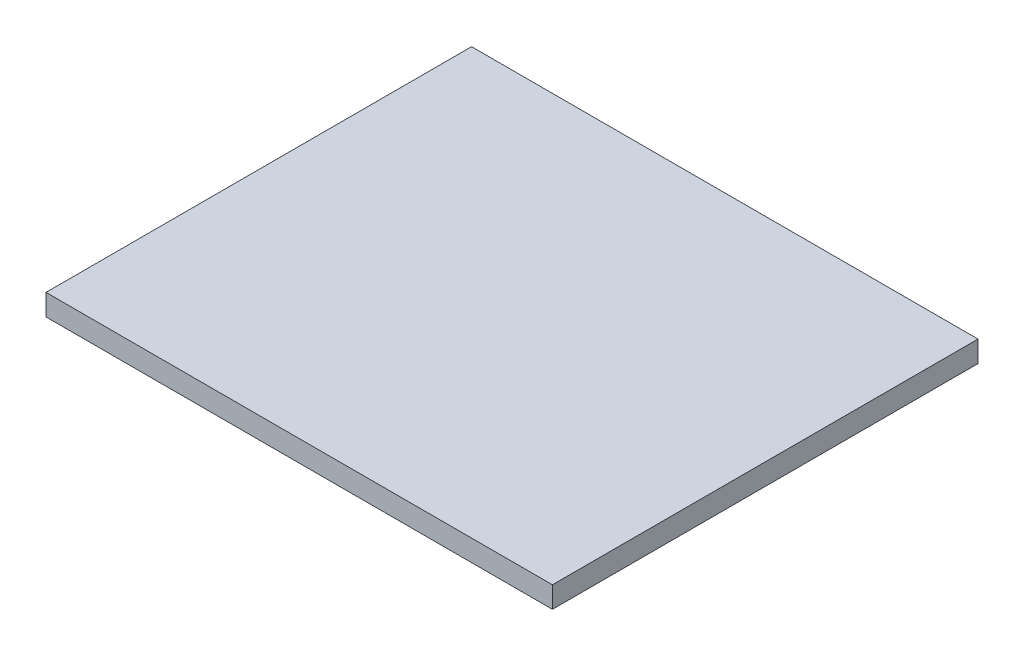
ISO-10303-21;
HEADER;
FILE_DESCRIPTION(('STEP AP214'),'2;1');
FILE_NAME('part.step','',(''),(''),'','','');
FILE_SCHEMA(('AUTOMOTIVE_DESIGN { 1 0 10303 214 1 1 1 1 }'));
ENDSEC;
DATA;
#1=APPLICATION_CONTEXT('core data for automotive mechanical design processes');
#2=APPLICATION_PROTOCOL_DEFINITION('international standard','automotive_design',2000,#1);
#3=PRODUCT_CONTEXT('',#1,'mechanical');
#4=PRODUCT('Part','Part','',(#3));
#5=PRODUCT_RELATED_PRODUCT_CATEGORY('part','',(#4));
#6=PRODUCT_DEFINITION_FORMATION('','',#4);
#7=PRODUCT_DEFINITION_CONTEXT('part definition',#1,'design');
#8=PRODUCT_DEFINITION('design','',#6,#7);
#9=PRODUCT_DEFINITION_SHAPE('','',#8);
#10=(LENGTH_UNIT() NAMED_UNIT(*) SI_UNIT(.MILLI.,.METRE.));
#11=(NAMED_UNIT(*) PLANE_ANGLE_UNIT() SI_UNIT($,.RADIAN.));
#12=(NAMED_UNIT(*) SI_UNIT($,.STERADIAN.) SOLID_ANGLE_UNIT());
#13=UNCERTAINTY_MEASURE_WITH_UNIT(LENGTH_MEASURE(1.E-05),#10,'distance_accuracy_value','');
#14=(GEOMETRIC_REPRESENTATION_CONTEXT(3) GLOBAL_UNCERTAINTY_ASSIGNED_CONTEXT((#13)) GLOBAL_UNIT_ASSIGNED_CONTEXT((#10,
#11,#12)) REPRESENTATION_CONTEXT('',''));
#15=CARTESIAN_POINT('',(0.,0.,0.));
#16=DIRECTION('',(0.,0.,1.));
#17=DIRECTION('',(1.,0.,0.));
#18=AXIS2_PLACEMENT_3D('',#15,#16,#17);
#19=CARTESIAN_POINT('',(0.,0.,0.));
#20=DIRECTION('',(0.,1.,0.));
#21=DIRECTION('',(0.,0.,1.));
#22=AXIS2_PLACEMENT_3D('',#19,#20,#21);
#23=PLANE('',#22);
#24=DIRECTION('',(0.,0.,-1.));
#25=VECTOR('',#24,1.);
#26=CARTESIAN_POINT('',(29.75,0.,-25.));
#27=LINE('',#26,#25);
#28=CARTESIAN_POINT('',(29.75,0.,25.));
#29=VERTEX_POINT('',#28);
#30=CARTESIAN_POINT('',(29.75,0.,-25.));
#31=VERTEX_POINT('',#30);
#32=EDGE_CURVE('E130',#29,#31,#27,.T.);
#33=ORIENTED_EDGE('',*,*,#32,.F.);
#34=DIRECTION('',(1.,0.,0.));
#35=VECTOR('',#34,1.);
#36=CARTESIAN_POINT('',(-29.75,0.,25.));
#37=LINE('',#36,#35);
#38=CARTESIAN_POINT('',(-29.75,0.,25.));
#39=VERTEX_POINT('',#38);
#40=EDGE_CURVE('E163',#39,#29,#37,.T.);
#41=ORIENTED_EDGE('',*,*,#40,.F.);
#42=DIRECTION('',(0.,0.,1.));
#43=VECTOR('',#42,1.);
#44=CARTESIAN_POINT('',(-29.75,0.,-25.));
#45=LINE('',#44,#43);
#46=CARTESIAN_POINT('',(-29.75,0.,-25.));
#47=VERTEX_POINT('',#46);
#48=EDGE_CURVE('E161',#47,#39,#45,.T.);
#49=ORIENTED_EDGE('',*,*,#48,.F.);
#50=DIRECTION('',(-1.,0.,0.));
#51=VECTOR('',#50,1.);
#52=CARTESIAN_POINT('',(-29.75,0.,-25.));
#53=LINE('',#52,#51);
#54=EDGE_CURVE('E156',#31,#47,#53,.T.);
#55=ORIENTED_EDGE('',*,*,#54,.F.);
#56=EDGE_LOOP('',(#33,#41,#49,#55));
#57=FACE_BOUND('',#56,.T.);
#58=DIRECTION('',(0.,0.,-1.));
#59=VECTOR('',#58,1.);
#60=CARTESIAN_POINT('',(-1.75,0.,2.43669858620224));
#61=LINE('',#60,#59);
#62=CARTESIAN_POINT('',(-1.75,0.,7.00000000000002));
#63=VERTEX_POINT('',#62);
#64=CARTESIAN_POINT('',(-1.75,0.,2.43669858620224));
#65=VERTEX_POINT('',#64);
#66=EDGE_CURVE('E56',#63,#65,#61,.T.);
#67=ORIENTED_EDGE('',*,*,#66,.F.);
#68=DIRECTION('',(1.,0.,0.));
#69=VECTOR('',#68,1.);
#70=CARTESIAN_POINT('',(0.,0.,7.00000000000002));
#71=LINE('',#70,#69);
#72=CARTESIAN_POINT('',(1.75,0.,7.00000000000002));
#73=VERTEX_POINT('',#72);
#74=EDGE_CURVE('E131',#63,#73,#71,.T.);
#75=ORIENTED_EDGE('',*,*,#74,.T.);
#76=DIRECTION('',(0.,0.,1.));
#77=VECTOR('',#76,1.);
#78=CARTESIAN_POINT('',(1.75,0.,2.43669858620224));
#79=LINE('',#78,#77);
#80=CARTESIAN_POINT('',(1.75,0.,2.43669858620224));
#81=VERTEX_POINT('',#80);
#82=EDGE_CURVE('E63',#81,#73,#79,.T.);
#83=ORIENTED_EDGE('',*,*,#82,.F.);
#84=CARTESIAN_POINT('',(0.,0.,0.));
#85=DIRECTION('',(0.,1.,0.));
#86=DIRECTION('',(0.,0.,1.));
#87=AXIS2_PLACEMENT_3D('',#84,#85,#86);
#88=CIRCLE('',#87,3.);
#89=EDGE_CURVE('E116',#81,#65,#88,.T.);
#90=ORIENTED_EDGE('',*,*,#89,.T.);
#91=EDGE_LOOP('',(#67,#75,#83,#90));
#92=FACE_BOUND('',#91,.T.);
#93=ADVANCED_FACE('F40',(#57,#92),#23,.F.);
#94=CARTESIAN_POINT('',(29.75,1.5,-25.));
#95=DIRECTION('',(-1.,0.,0.));
#96=DIRECTION('',(0.,0.,1.));
#97=AXIS2_PLACEMENT_3D('',#94,#95,#96);
#98=PLANE('',#97);
#99=ORIENTED_EDGE('',*,*,#32,.T.);
#100=DIRECTION('',(0.,-1.,0.));
#101=VECTOR('',#100,1.);
#102=CARTESIAN_POINT('',(29.75,1.5,-25.));
#103=LINE('',#102,#101);
#104=CARTESIAN_POINT('',(29.75,2.5,-25.));
#105=VERTEX_POINT('',#104);
#106=EDGE_CURVE('E122',#105,#31,#103,.T.);
#107=ORIENTED_EDGE('',*,*,#106,.F.);
#108=DIRECTION('',(0.,0.,-1.));
#109=VECTOR('',#108,1.);
#110=CARTESIAN_POINT('',(29.75,2.5,25.));
#111=LINE('',#110,#109);
#112=CARTESIAN_POINT('',(29.75,2.5,25.));
#113=VERTEX_POINT('',#112);
#114=EDGE_CURVE('E105',#113,#105,#111,.T.);
#115=ORIENTED_EDGE('',*,*,#114,.F.);
#116=DIRECTION('',(0.,-1.,0.));
#117=VECTOR('',#116,1.);
#118=CARTESIAN_POINT('',(29.75,1.5,25.));
#119=LINE('',#118,#117);
#120=EDGE_CURVE('E165',#113,#29,#119,.T.);
#121=ORIENTED_EDGE('',*,*,#120,.T.);
#122=EDGE_LOOP('',(#99,#107,#115,#121));
#123=FACE_BOUND('',#122,.T.);
#124=ADVANCED_FACE('F128',(#123),#98,.F.);
#125=CARTESIAN_POINT('',(-29.75,1.5,-25.));
#126=DIRECTION('',(0.,0.,1.));
#127=DIRECTION('',(1.,0.,0.));
#128=AXIS2_PLACEMENT_3D('',#125,#126,#127);
#129=PLANE('',#128);
#130=DIRECTION('',(0.,-1.,0.));
#131=VECTOR('',#130,1.);
#132=CARTESIAN_POINT('',(-29.75,1.5,-25.));
#133=LINE('',#132,#131);
#134=CARTESIAN_POINT('',(-29.75,2.5,-25.));
#135=VERTEX_POINT('',#134);
#136=EDGE_CURVE('E125',#135,#47,#133,.T.);
#137=ORIENTED_EDGE('',*,*,#136,.F.);
#138=DIRECTION('',(1.,0.,0.));
#139=VECTOR('',#138,1.);
#140=CARTESIAN_POINT('',(-29.75,2.5,-25.));
#141=LINE('',#140,#139);
#142=EDGE_CURVE('E109',#135,#105,#141,.T.);
#143=ORIENTED_EDGE('',*,*,#142,.T.);
#144=ORIENTED_EDGE('',*,*,#106,.T.);
#145=ORIENTED_EDGE('',*,*,#54,.T.);
#146=EDGE_LOOP('',(#137,#143,#144,#145));
#147=FACE_BOUND('',#146,.T.);
#148=ADVANCED_FACE('F121',(#147),#129,.F.);
#149=CARTESIAN_POINT('',(-29.75,1.5,-25.));
#150=DIRECTION('',(1.,0.,0.));
#151=DIRECTION('',(0.,0.,-1.));
#152=AXIS2_PLACEMENT_3D('',#149,#150,#151);
#153=PLANE('',#152);
#154=ORIENTED_EDGE('',*,*,#48,.T.);
#155=DIRECTION('',(0.,-1.,0.));
#156=VECTOR('',#155,1.);
#157=CARTESIAN_POINT('',(-29.75,1.5,25.));
#158=LINE('',#157,#156);
#159=CARTESIAN_POINT('',(-29.75,2.5,25.));
#160=VERTEX_POINT('',#159);
#161=EDGE_CURVE('E134',#160,#39,#158,.T.);
#162=ORIENTED_EDGE('',*,*,#161,.F.);
#163=DIRECTION('',(0.,0.,-1.));
#164=VECTOR('',#163,1.);
#165=CARTESIAN_POINT('',(-29.75,2.5,25.));
#166=LINE('',#165,#164);
#167=EDGE_CURVE('E117',#160,#135,#166,.T.);
#168=ORIENTED_EDGE('',*,*,#167,.T.);
#169=ORIENTED_EDGE('',*,*,#136,.T.);
#170=EDGE_LOOP('',(#154,#162,#168,#169));
#171=FACE_BOUND('',#170,.T.);
#172=ADVANCED_FACE('F174',(#171),#153,.F.);
#173=CARTESIAN_POINT('',(-29.75,1.5,25.));
#174=DIRECTION('',(0.,0.,-1.));
#175=DIRECTION('',(-1.,0.,0.));
#176=AXIS2_PLACEMENT_3D('',#173,#174,#175);
#177=PLANE('',#176);
#178=ORIENTED_EDGE('',*,*,#120,.F.);
#179=DIRECTION('',(1.,0.,0.));
#180=VECTOR('',#179,1.);
#181=CARTESIAN_POINT('',(-29.75,2.5,25.));
#182=LINE('',#181,#180);
#183=EDGE_CURVE('E111',#160,#113,#182,.T.);
#184=ORIENTED_EDGE('',*,*,#183,.F.);
#185=ORIENTED_EDGE('',*,*,#161,.T.);
#186=ORIENTED_EDGE('',*,*,#40,.T.);
#187=EDGE_LOOP('',(#178,#184,#185,#186));
#188=FACE_BOUND('',#187,.T.);
#189=ADVANCED_FACE('F170',(#188),#177,.F.);
#190=CARTESIAN_POINT('',(0.,1.5,0.));
#191=DIRECTION('',(0.,-1.,0.));
#192=DIRECTION('',(0.,0.,-1.));
#193=AXIS2_PLACEMENT_3D('',#190,#191,#192);
#194=CYLINDRICAL_SURFACE('',#193,3.);
#195=DIRECTION('',(0.,-1.,0.));
#196=VECTOR('',#195,1.);
#197=CARTESIAN_POINT('',(-1.75,2.,2.43669858620224));
#198=LINE('',#197,#196);
#199=CARTESIAN_POINT('',(-1.75,2.,2.43669858620224));
#200=VERTEX_POINT('',#199);
#201=EDGE_CURVE('E154',#200,#65,#198,.T.);
#202=ORIENTED_EDGE('',*,*,#201,.T.);
#203=ORIENTED_EDGE('',*,*,#89,.F.);
#204=DIRECTION('',(0.,-1.,0.));
#205=VECTOR('',#204,1.);
#206=CARTESIAN_POINT('',(1.75,2.,2.43669858620224));
#207=LINE('',#206,#205);
#208=CARTESIAN_POINT('',(1.75,2.,2.43669858620224));
#209=VERTEX_POINT('',#208);
#210=EDGE_CURVE('E152',#209,#81,#207,.T.);
#211=ORIENTED_EDGE('',*,*,#210,.F.);
#212=CARTESIAN_POINT('',(0.,2.,0.));
#213=DIRECTION('',(0.,-1.,0.));
#214=DIRECTION('',(0.,0.,-1.));
#215=AXIS2_PLACEMENT_3D('',#212,#213,#214);
#216=CIRCLE('',#215,3.);
#217=EDGE_CURVE('E178',#200,#209,#216,.T.);
#218=ORIENTED_EDGE('',*,*,#217,.F.);
#219=EDGE_LOOP('',(#202,#203,#211,#218));
#220=FACE_BOUND('',#219,.T.);
#221=ADVANCED_FACE('F150',(#220),#194,.F.);
#222=CARTESIAN_POINT('',(-1.75,2.,2.43669858620224));
#223=DIRECTION('',(-1.,0.,0.));
#224=DIRECTION('',(0.,0.,1.));
#225=AXIS2_PLACEMENT_3D('',#222,#223,#224);
#226=PLANE('',#225);
#227=ORIENTED_EDGE('',*,*,#66,.T.);
#228=ORIENTED_EDGE('',*,*,#201,.F.);
#229=DIRECTION('',(0.,0.,-1.));
#230=VECTOR('',#229,1.);
#231=CARTESIAN_POINT('',(-1.75,2.,2.43669858620224));
#232=LINE('',#231,#230);
#233=CARTESIAN_POINT('',(-1.75,2.,5.));
#234=VERTEX_POINT('',#233);
#235=EDGE_CURVE('E142',#234,#200,#232,.T.);
#236=ORIENTED_EDGE('',*,*,#235,.F.);
#237=DIRECTION('',(0.,0.707106781186545,-0.70710678118655));
#238=VECTOR('',#237,1.);
#239=CARTESIAN_POINT('',(-1.75,3.28165070689888,3.71834929310111));
#240=LINE('',#239,#238);
#241=EDGE_CURVE('E49',#234,#63,#240,.F.);
#242=ORIENTED_EDGE('',*,*,#241,.T.);
#243=EDGE_LOOP('',(#227,#228,#236,#242));
#244=FACE_BOUND('',#243,.T.);
#245=ADVANCED_FACE('F140',(#244),#226,.F.);
#246=CARTESIAN_POINT('',(1.75,2.,2.43669858620224));
#247=DIRECTION('',(1.,0.,0.));
#248=DIRECTION('',(0.,0.,-1.));
#249=AXIS2_PLACEMENT_3D('',#246,#247,#248);
#250=PLANE('',#249);
#251=ORIENTED_EDGE('',*,*,#82,.T.);
#252=DIRECTION('',(0.,-0.707106781186545,0.70710678118655));
#253=VECTOR('',#252,1.);
#254=CARTESIAN_POINT('',(1.75,3.28165070689888,3.71834929310111));
#255=LINE('',#254,#253);
#256=CARTESIAN_POINT('',(1.75,2.,5.));
#257=VERTEX_POINT('',#256);
#258=EDGE_CURVE('E11',#73,#257,#255,.F.);
#259=ORIENTED_EDGE('',*,*,#258,.T.);
#260=DIRECTION('',(0.,0.,1.));
#261=VECTOR('',#260,1.);
#262=CARTESIAN_POINT('',(1.75,2.,2.43669858620224));
#263=LINE('',#262,#261);
#264=EDGE_CURVE('E183',#209,#257,#263,.T.);
#265=ORIENTED_EDGE('',*,*,#264,.F.);
#266=ORIENTED_EDGE('',*,*,#210,.T.);
#267=EDGE_LOOP('',(#251,#259,#265,#266));
#268=FACE_BOUND('',#267,.T.);
#269=ADVANCED_FACE('F190',(#268),#250,.F.);
#270=CARTESIAN_POINT('',(0.,2.,0.));
#271=DIRECTION('',(0.,-1.,0.));
#272=DIRECTION('',(0.,0.,-1.));
#273=AXIS2_PLACEMENT_3D('',#270,#271,#272);
#274=PLANE('',#273);
#275=ORIENTED_EDGE('',*,*,#217,.T.);
#276=ORIENTED_EDGE('',*,*,#264,.T.);
#277=DIRECTION('',(-1.,0.,0.));
#278=VECTOR('',#277,1.);
#279=CARTESIAN_POINT('',(1.75,2.,5.));
#280=LINE('',#279,#278);
#281=EDGE_CURVE('E181',#257,#234,#280,.T.);
#282=ORIENTED_EDGE('',*,*,#281,.T.);
#283=ORIENTED_EDGE('',*,*,#235,.T.);
#284=EDGE_LOOP('',(#275,#276,#282,#283));
#285=FACE_BOUND('',#284,.T.);
#286=ADVANCED_FACE('F189',(#285),#274,.T.);
#287=CARTESIAN_POINT('',(1.75,2.,5.));
#288=DIRECTION('',(0.,0.70710678118655,0.707106781186545));
#289=DIRECTION('',(-1.,0.,0.));
#290=AXIS2_PLACEMENT_3D('',#287,#288,#289);
#291=PLANE('',#290);
#292=ORIENTED_EDGE('',*,*,#258,.F.);
#293=ORIENTED_EDGE('',*,*,#74,.F.);
#294=ORIENTED_EDGE('',*,*,#241,.F.);
#295=ORIENTED_EDGE('',*,*,#281,.F.);
#296=EDGE_LOOP('',(#292,#293,#294,#295));
#297=FACE_BOUND('',#296,.T.);
#298=ADVANCED_FACE('F43',(#297),#291,.F.);
#299=CARTESIAN_POINT('',(-29.75,2.5,-25.));
#300=DIRECTION('',(0.,-1.,0.));
#301=DIRECTION('',(0.,0.,-1.));
#302=AXIS2_PLACEMENT_3D('',#299,#300,#301);
#303=PLANE('',#302);
#304=ORIENTED_EDGE('',*,*,#183,.T.);
#305=ORIENTED_EDGE('',*,*,#114,.T.);
#306=ORIENTED_EDGE('',*,*,#142,.F.);
#307=ORIENTED_EDGE('',*,*,#167,.F.);
#308=EDGE_LOOP('',(#304,#305,#306,#307));
#309=FACE_BOUND('',#308,.T.);
#310=ADVANCED_FACE('F107',(#309),#303,.F.);
#311=CLOSED_SHELL('',(#93,#124,#148,#172,#189,#221,#245,#269,#286,#298,#310));
#312=MANIFOLD_SOLID_BREP('B2',#311);
#313=ADVANCED_BREP_SHAPE_REPRESENTATION('',(#18,#312),#14);
#314=SHAPE_DEFINITION_REPRESENTATION(#9,#313);
ENDSEC;
END-ISO-10303-21;
